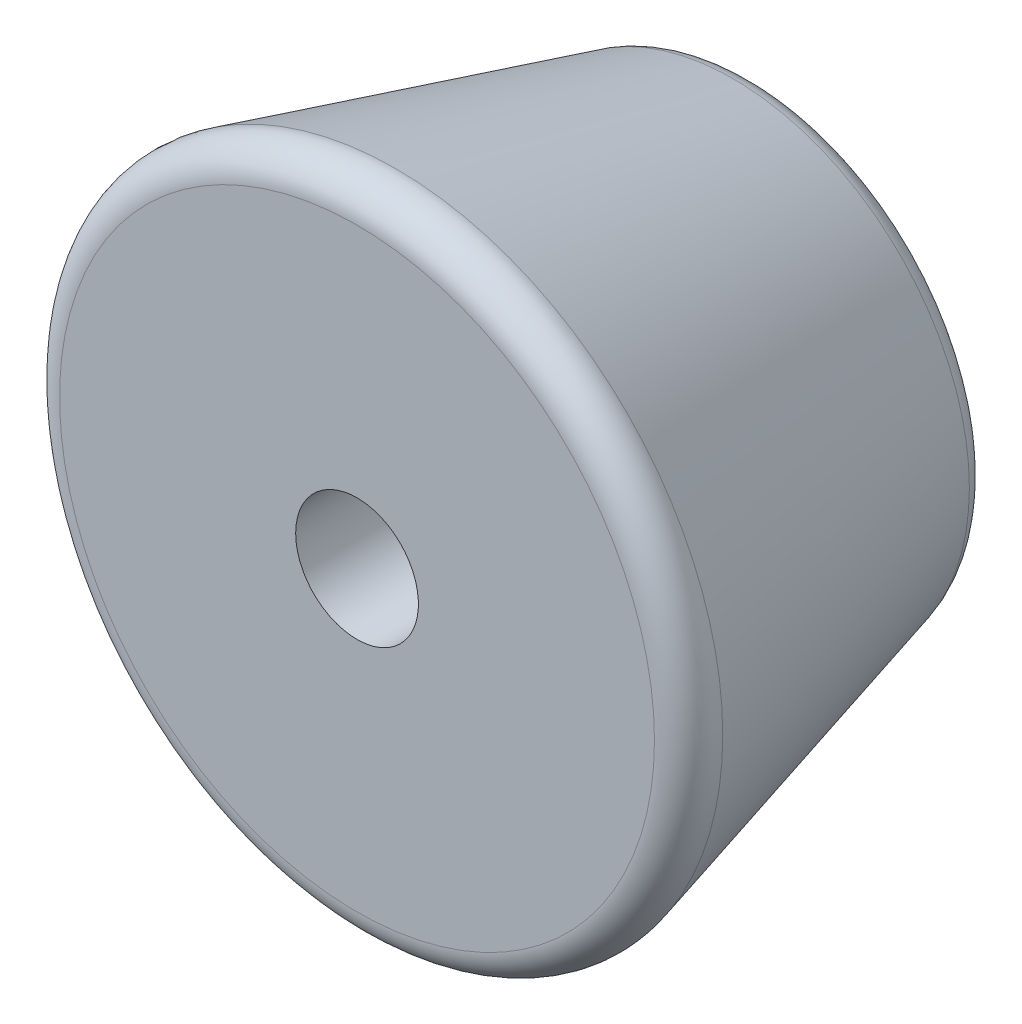
ISO-10303-21;
HEADER;
FILE_DESCRIPTION(('STEP AP214'),'2;1');
FILE_NAME('part.step','',(''),(''),'','','');
FILE_SCHEMA(('AUTOMOTIVE_DESIGN { 1 0 10303 214 1 1 1 1 }'));
ENDSEC;
DATA;
#1=APPLICATION_CONTEXT('core data for automotive mechanical design processes');
#2=APPLICATION_PROTOCOL_DEFINITION('international standard','automotive_design',2000,#1);
#3=PRODUCT_CONTEXT('',#1,'mechanical');
#4=PRODUCT('Part','Part','',(#3));
#5=PRODUCT_RELATED_PRODUCT_CATEGORY('part','',(#4));
#6=PRODUCT_DEFINITION_FORMATION('','',#4);
#7=PRODUCT_DEFINITION_CONTEXT('part definition',#1,'design');
#8=PRODUCT_DEFINITION('design','',#6,#7);
#9=PRODUCT_DEFINITION_SHAPE('','',#8);
#10=(LENGTH_UNIT() NAMED_UNIT(*) SI_UNIT(.MILLI.,.METRE.));
#11=(NAMED_UNIT(*) PLANE_ANGLE_UNIT() SI_UNIT($,.RADIAN.));
#12=(NAMED_UNIT(*) SI_UNIT($,.STERADIAN.) SOLID_ANGLE_UNIT());
#13=UNCERTAINTY_MEASURE_WITH_UNIT(LENGTH_MEASURE(1.E-05),#10,'distance_accuracy_value','');
#14=(GEOMETRIC_REPRESENTATION_CONTEXT(3) GLOBAL_UNCERTAINTY_ASSIGNED_CONTEXT((#13)) GLOBAL_UNIT_ASSIGNED_CONTEXT((#10,
#11,#12)) REPRESENTATION_CONTEXT('',''));
#15=CARTESIAN_POINT('',(0.,0.,0.));
#16=DIRECTION('',(0.,0.,1.));
#17=DIRECTION('',(1.,0.,0.));
#18=AXIS2_PLACEMENT_3D('',#15,#16,#17);
#19=CARTESIAN_POINT('',(11.,0.,0.));
#20=DIRECTION('',(0.,0.,1.));
#21=DIRECTION('',(1.,0.,0.));
#22=AXIS2_PLACEMENT_3D('',#19,#20,#21);
#23=PLANE('',#22);
#24=CARTESIAN_POINT('',(0.,0.,0.));
#25=DIRECTION('',(0.,0.,1.));
#26=DIRECTION('',(1.,0.,0.));
#27=AXIS2_PLACEMENT_3D('',#24,#25,#26);
#28=CIRCLE('',#27,9.69516061401259);
#29=CARTESIAN_POINT('',(9.69516061401259,0.,0.));
#30=VERTEX_POINT('',#29);
#31=EDGE_CURVE('E10',#30,#30,#28,.T.);
#32=ORIENTED_EDGE('',*,*,#31,.T.);
#33=EDGE_LOOP('',(#32));
#34=FACE_BOUND('',#33,.T.);
#35=CARTESIAN_POINT('',(0.,0.,0.));
#36=DIRECTION('',(0.,0.,-1.));
#37=DIRECTION('',(-1.,0.,0.));
#38=AXIS2_PLACEMENT_3D('',#35,#36,#37);
#39=CIRCLE('',#38,2.);
#40=CARTESIAN_POINT('',(-2.,0.,0.));
#41=VERTEX_POINT('',#40);
#42=EDGE_CURVE('E66',#41,#41,#39,.T.);
#43=ORIENTED_EDGE('',*,*,#42,.T.);
#44=EDGE_LOOP('',(#43));
#45=FACE_BOUND('',#44,.T.);
#46=ADVANCED_FACE('F37',(#34,#45),#23,.T.);
#47=CARTESIAN_POINT('',(0.,0.,-13.));
#48=DIRECTION('',(0.,0.,-1.));
#49=DIRECTION('',(-1.,0.,0.));
#50=AXIS2_PLACEMENT_3D('',#47,#48,#49);
#51=PLANE('',#50);
#52=CARTESIAN_POINT('',(0.,0.,-13.));
#53=DIRECTION('',(0.,0.,-1.));
#54=DIRECTION('',(-1.,0.,0.));
#55=AXIS2_PLACEMENT_3D('',#52,#53,#54);
#56=CIRCLE('',#55,6.73362215247413);
#57=CARTESIAN_POINT('',(-6.73362215247413,0.,-13.));
#58=VERTEX_POINT('',#57);
#59=EDGE_CURVE('E48',#58,#58,#56,.T.);
#60=ORIENTED_EDGE('',*,*,#59,.T.);
#61=EDGE_LOOP('',(#60));
#62=FACE_BOUND('',#61,.T.);
#63=CARTESIAN_POINT('',(0.,0.,-13.));
#64=DIRECTION('',(0.,0.,-1.));
#65=DIRECTION('',(-1.,0.,0.));
#66=AXIS2_PLACEMENT_3D('',#63,#64,#65);
#67=CIRCLE('',#66,6.);
#68=CARTESIAN_POINT('',(-6.,0.,-13.));
#69=VERTEX_POINT('',#68);
#70=EDGE_CURVE('E52',#69,#69,#67,.F.);
#71=ORIENTED_EDGE('',*,*,#70,.T.);
#72=EDGE_LOOP('',(#71));
#73=FACE_BOUND('',#72,.T.);
#74=ADVANCED_FACE('F94',(#62,#73),#51,.T.);
#75=CARTESIAN_POINT('',(0.,0.,0.));
#76=DIRECTION('',(0.,0.,1.));
#77=DIRECTION('',(1.,0.,0.));
#78=AXIS2_PLACEMENT_3D('',#75,#76,#77);
#79=CONICAL_SURFACE('',#78,11.,0.26299473168092);
#80=CARTESIAN_POINT('',(0.,0.,-12.2599734734479));
#81=DIRECTION('',(0.,0.,-1.));
#82=DIRECTION('',(-1.,0.,0.));
#83=AXIS2_PLACEMENT_3D('',#80,#81,#82);
#84=CIRCLE('',#83,7.69923791099481);
#85=CARTESIAN_POINT('',(-7.69923791099481,0.,-12.2599734734479));
#86=VERTEX_POINT('',#85);
#87=EDGE_CURVE('E57',#86,#86,#84,.F.);
#88=ORIENTED_EDGE('',*,*,#87,.T.);
#89=EDGE_LOOP('',(#88));
#90=FACE_BOUND('',#89,.T.);
#91=CARTESIAN_POINT('',(0.,0.,-1.25997347344787));
#92=DIRECTION('',(0.,0.,-1.));
#93=DIRECTION('',(-1.,0.,0.));
#94=AXIS2_PLACEMENT_3D('',#91,#92,#93);
#95=CIRCLE('',#94,10.6607763725333);
#96=CARTESIAN_POINT('',(-10.6607763725333,0.,-1.25997347344787));
#97=VERTEX_POINT('',#96);
#98=EDGE_CURVE('E60',#97,#97,#95,.T.);
#99=ORIENTED_EDGE('',*,*,#98,.T.);
#100=EDGE_LOOP('',(#99));
#101=FACE_BOUND('',#100,.T.);
#102=ADVANCED_FACE('F89',(#90,#101),#79,.T.);
#103=CARTESIAN_POINT('',(0.,0.,-6.));
#104=DIRECTION('',(0.,0.,-1.));
#105=DIRECTION('',(-1.,0.,0.));
#106=AXIS2_PLACEMENT_3D('',#103,#104,#105);
#107=CYLINDRICAL_SURFACE('',#106,5.);
#108=CARTESIAN_POINT('',(0.,0.,-12.));
#109=DIRECTION('',(0.,0.,-1.));
#110=DIRECTION('',(-1.,0.,0.));
#111=AXIS2_PLACEMENT_3D('',#108,#109,#110);
#112=CIRCLE('',#111,5.);
#113=CARTESIAN_POINT('',(-5.,0.,-12.));
#114=VERTEX_POINT('',#113);
#115=EDGE_CURVE('E44',#114,#114,#112,.T.);
#116=ORIENTED_EDGE('',*,*,#115,.T.);
#117=EDGE_LOOP('',(#116));
#118=FACE_BOUND('',#117,.T.);
#119=CARTESIAN_POINT('',(0.,0.,-6.));
#120=DIRECTION('',(0.,0.,-1.));
#121=DIRECTION('',(-1.,0.,0.));
#122=AXIS2_PLACEMENT_3D('',#119,#120,#121);
#123=CIRCLE('',#122,5.);
#124=CARTESIAN_POINT('',(-5.,0.,-6.));
#125=VERTEX_POINT('',#124);
#126=EDGE_CURVE('E63',#125,#125,#123,.T.);
#127=ORIENTED_EDGE('',*,*,#126,.F.);
#128=EDGE_LOOP('',(#127));
#129=FACE_BOUND('',#128,.T.);
#130=ADVANCED_FACE('F84',(#118,#129),#107,.F.);
#131=CARTESIAN_POINT('',(0.,0.,-6.));
#132=DIRECTION('',(0.,0.,-1.));
#133=DIRECTION('',(-1.,0.,0.));
#134=AXIS2_PLACEMENT_3D('',#131,#132,#133);
#135=PLANE('',#134);
#136=CARTESIAN_POINT('',(0.,0.,-6.));
#137=DIRECTION('',(0.,0.,-1.));
#138=DIRECTION('',(-1.,0.,0.));
#139=AXIS2_PLACEMENT_3D('',#136,#137,#138);
#140=CIRCLE('',#139,2.);
#141=CARTESIAN_POINT('',(-2.,0.,-6.));
#142=VERTEX_POINT('',#141);
#143=EDGE_CURVE('E67',#142,#142,#140,.T.);
#144=ORIENTED_EDGE('',*,*,#143,.F.);
#145=EDGE_LOOP('',(#144));
#146=FACE_BOUND('',#145,.T.);
#147=ORIENTED_EDGE('',*,*,#126,.T.);
#148=EDGE_LOOP('',(#147));
#149=FACE_BOUND('',#148,.T.);
#150=ADVANCED_FACE('F78',(#146,#149),#135,.T.);
#151=CARTESIAN_POINT('',(0.,0.,0.));
#152=DIRECTION('',(0.,0.,-1.));
#153=DIRECTION('',(-1.,0.,0.));
#154=AXIS2_PLACEMENT_3D('',#151,#152,#153);
#155=CYLINDRICAL_SURFACE('',#154,2.);
#156=ORIENTED_EDGE('',*,*,#42,.F.);
#157=EDGE_LOOP('',(#156));
#158=FACE_BOUND('',#157,.T.);
#159=ORIENTED_EDGE('',*,*,#143,.T.);
#160=EDGE_LOOP('',(#159));
#161=FACE_BOUND('',#160,.T.);
#162=ADVANCED_FACE('F74',(#158,#161),#155,.F.);
#163=CARTESIAN_POINT('',(0.,0.,-12.));
#164=DIRECTION('',(0.,0.,-1.));
#165=DIRECTION('',(-1.,0.,0.));
#166=AXIS2_PLACEMENT_3D('',#163,#164,#165);
#167=TOROIDAL_SURFACE('',#166,6.73362215247413,1.);
#168=ORIENTED_EDGE('',*,*,#59,.F.);
#169=EDGE_LOOP('',(#168));
#170=FACE_BOUND('',#169,.T.);
#171=ORIENTED_EDGE('',*,*,#87,.F.);
#172=EDGE_LOOP('',(#171));
#173=FACE_BOUND('',#172,.T.);
#174=ADVANCED_FACE('F77',(#170,#173),#167,.T.);
#175=CARTESIAN_POINT('',(0.,0.,-12.));
#176=DIRECTION('',(0.,0.,-1.));
#177=DIRECTION('',(-1.,0.,0.));
#178=AXIS2_PLACEMENT_3D('',#175,#176,#177);
#179=TOROIDAL_SURFACE('',#178,6.,1.);
#180=ORIENTED_EDGE('',*,*,#70,.F.);
#181=EDGE_LOOP('',(#180));
#182=FACE_BOUND('',#181,.T.);
#183=ORIENTED_EDGE('',*,*,#115,.F.);
#184=EDGE_LOOP('',(#183));
#185=FACE_BOUND('',#184,.T.);
#186=ADVANCED_FACE('F106',(#182,#185),#179,.T.);
#187=CARTESIAN_POINT('',(0.,0.,-1.));
#188=DIRECTION('',(0.,0.,1.));
#189=DIRECTION('',(1.,0.,0.));
#190=AXIS2_PLACEMENT_3D('',#187,#188,#189);
#191=TOROIDAL_SURFACE('',#190,9.69516061401259,1.);
#192=ORIENTED_EDGE('',*,*,#98,.F.);
#193=EDGE_LOOP('',(#192));
#194=FACE_BOUND('',#193,.T.);
#195=ORIENTED_EDGE('',*,*,#31,.F.);
#196=EDGE_LOOP('',(#195));
#197=FACE_BOUND('',#196,.T.);
#198=ADVANCED_FACE('F39',(#194,#197),#191,.T.);
#199=CLOSED_SHELL('',(#46,#74,#102,#130,#150,#162,#174,#186,#198));
#200=MANIFOLD_SOLID_BREP('B2',#199);
#201=ADVANCED_BREP_SHAPE_REPRESENTATION('',(#18,#200),#14);
#202=SHAPE_DEFINITION_REPRESENTATION(#9,#201);
ENDSEC;
END-ISO-10303-21;
